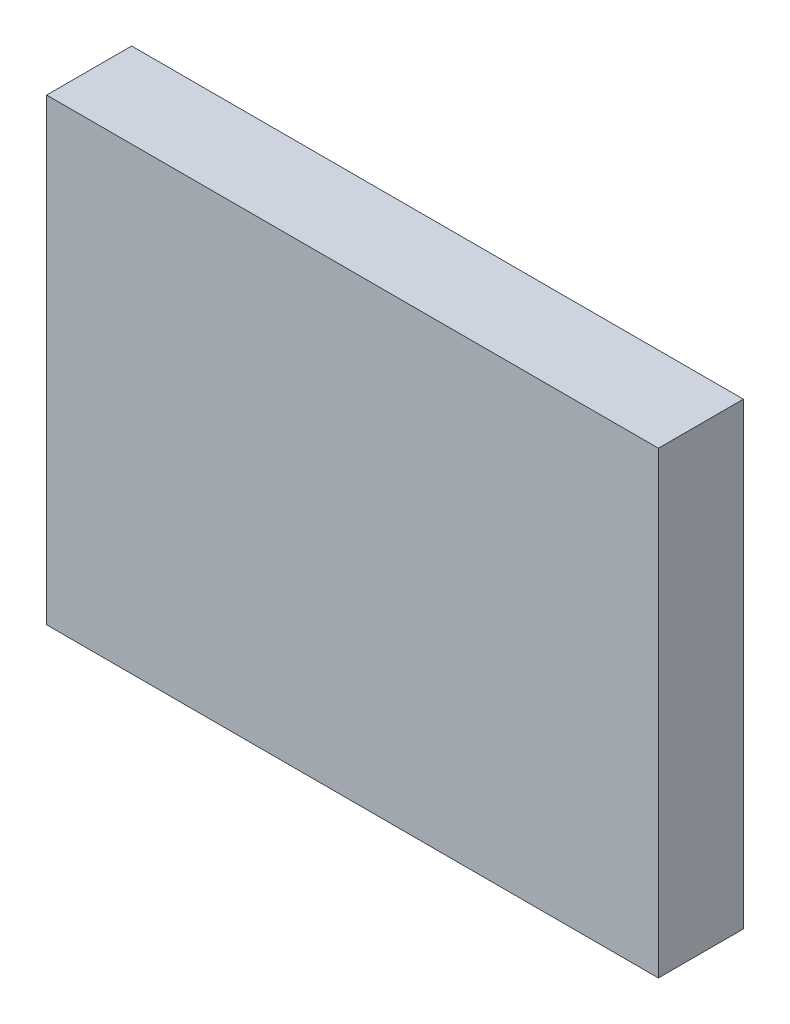
ISO-10303-21;
HEADER;
FILE_DESCRIPTION(('STEP AP214'),'2;1');
FILE_NAME('part.step','',(''),(''),'','','');
FILE_SCHEMA(('AUTOMOTIVE_DESIGN { 1 0 10303 214 1 1 1 1 }'));
ENDSEC;
DATA;
#1=APPLICATION_CONTEXT('core data for automotive mechanical design processes');
#2=APPLICATION_PROTOCOL_DEFINITION('international standard','automotive_design',2000,#1);
#3=PRODUCT_CONTEXT('',#1,'mechanical');
#4=PRODUCT('Part','Part','',(#3));
#5=PRODUCT_RELATED_PRODUCT_CATEGORY('part','',(#4));
#6=PRODUCT_DEFINITION_FORMATION('','',#4);
#7=PRODUCT_DEFINITION_CONTEXT('part definition',#1,'design');
#8=PRODUCT_DEFINITION('design','',#6,#7);
#9=PRODUCT_DEFINITION_SHAPE('','',#8);
#10=(LENGTH_UNIT() NAMED_UNIT(*) SI_UNIT(.MILLI.,.METRE.));
#11=(NAMED_UNIT(*) PLANE_ANGLE_UNIT() SI_UNIT($,.RADIAN.));
#12=(NAMED_UNIT(*) SI_UNIT($,.STERADIAN.) SOLID_ANGLE_UNIT());
#13=UNCERTAINTY_MEASURE_WITH_UNIT(LENGTH_MEASURE(1.E-05),#10,'distance_accuracy_value','');
#14=(GEOMETRIC_REPRESENTATION_CONTEXT(3) GLOBAL_UNCERTAINTY_ASSIGNED_CONTEXT((#13)) GLOBAL_UNIT_ASSIGNED_CONTEXT((#10,
#11,#12)) REPRESENTATION_CONTEXT('',''));
#15=CARTESIAN_POINT('',(0.,0.,0.));
#16=DIRECTION('',(0.,0.,1.));
#17=DIRECTION('',(1.,0.,0.));
#18=AXIS2_PLACEMENT_3D('',#15,#16,#17);
#19=CARTESIAN_POINT('',(180.,135.,50.));
#20=DIRECTION('',(-1.,0.,0.));
#21=DIRECTION('',(0.,0.,1.));
#22=AXIS2_PLACEMENT_3D('',#19,#20,#21);
#23=PLANE('',#22);
#24=DIRECTION('',(0.,1.,0.));
#25=VECTOR('',#24,1.);
#26=CARTESIAN_POINT('',(180.,135.,0.));
#27=LINE('',#26,#25);
#28=CARTESIAN_POINT('',(180.,-135.,0.));
#29=VERTEX_POINT('',#28);
#30=CARTESIAN_POINT('',(180.,135.,0.));
#31=VERTEX_POINT('',#30);
#32=EDGE_CURVE('E106',#29,#31,#27,.T.);
#33=ORIENTED_EDGE('',*,*,#32,.T.);
#34=DIRECTION('',(0.,0.,-1.));
#35=VECTOR('',#34,1.);
#36=CARTESIAN_POINT('',(180.,135.,50.));
#37=LINE('',#36,#35);
#38=CARTESIAN_POINT('',(180.,135.,50.));
#39=VERTEX_POINT('',#38);
#40=EDGE_CURVE('E11',#39,#31,#37,.T.);
#41=ORIENTED_EDGE('',*,*,#40,.F.);
#42=DIRECTION('',(0.,1.,0.));
#43=VECTOR('',#42,1.);
#44=CARTESIAN_POINT('',(180.,135.,50.));
#45=LINE('',#44,#43);
#46=CARTESIAN_POINT('',(180.,-135.,50.));
#47=VERTEX_POINT('',#46);
#48=EDGE_CURVE('E89',#47,#39,#45,.T.);
#49=ORIENTED_EDGE('',*,*,#48,.F.);
#50=DIRECTION('',(0.,0.,-1.));
#51=VECTOR('',#50,1.);
#52=CARTESIAN_POINT('',(180.,-135.,50.));
#53=LINE('',#52,#51);
#54=EDGE_CURVE('E102',#47,#29,#53,.T.);
#55=ORIENTED_EDGE('',*,*,#54,.T.);
#56=EDGE_LOOP('',(#33,#41,#49,#55));
#57=FACE_BOUND('',#56,.T.);
#58=ADVANCED_FACE('F38',(#57),#23,.F.);
#59=CARTESIAN_POINT('',(-180.,135.,50.));
#60=DIRECTION('',(0.,-1.,0.));
#61=DIRECTION('',(0.,0.,-1.));
#62=AXIS2_PLACEMENT_3D('',#59,#60,#61);
#63=PLANE('',#62);
#64=DIRECTION('',(-1.,0.,0.));
#65=VECTOR('',#64,1.);
#66=CARTESIAN_POINT('',(-180.,135.,0.));
#67=LINE('',#66,#65);
#68=CARTESIAN_POINT('',(-180.,135.,0.));
#69=VERTEX_POINT('',#68);
#70=EDGE_CURVE('E94',#31,#69,#67,.T.);
#71=ORIENTED_EDGE('',*,*,#70,.T.);
#72=DIRECTION('',(0.,0.,-1.));
#73=VECTOR('',#72,1.);
#74=CARTESIAN_POINT('',(-180.,135.,50.));
#75=LINE('',#74,#73);
#76=CARTESIAN_POINT('',(-180.,135.,50.));
#77=VERTEX_POINT('',#76);
#78=EDGE_CURVE('E46',#77,#69,#75,.T.);
#79=ORIENTED_EDGE('',*,*,#78,.F.);
#80=DIRECTION('',(-1.,0.,0.));
#81=VECTOR('',#80,1.);
#82=CARTESIAN_POINT('',(-180.,135.,50.));
#83=LINE('',#82,#81);
#84=EDGE_CURVE('E84',#39,#77,#83,.T.);
#85=ORIENTED_EDGE('',*,*,#84,.F.);
#86=ORIENTED_EDGE('',*,*,#40,.T.);
#87=EDGE_LOOP('',(#71,#79,#85,#86));
#88=FACE_BOUND('',#87,.T.);
#89=ADVANCED_FACE('F93',(#88),#63,.F.);
#90=CARTESIAN_POINT('',(-180.,135.,50.));
#91=DIRECTION('',(1.,0.,0.));
#92=DIRECTION('',(0.,0.,-1.));
#93=AXIS2_PLACEMENT_3D('',#90,#91,#92);
#94=PLANE('',#93);
#95=DIRECTION('',(0.,-1.,0.));
#96=VECTOR('',#95,1.);
#97=CARTESIAN_POINT('',(-180.,135.,0.));
#98=LINE('',#97,#96);
#99=CARTESIAN_POINT('',(-180.,-135.,0.));
#100=VERTEX_POINT('',#99);
#101=EDGE_CURVE('E71',#69,#100,#98,.T.);
#102=ORIENTED_EDGE('',*,*,#101,.T.);
#103=DIRECTION('',(0.,0.,-1.));
#104=VECTOR('',#103,1.);
#105=CARTESIAN_POINT('',(-180.,-135.,50.));
#106=LINE('',#105,#104);
#107=CARTESIAN_POINT('',(-180.,-135.,50.));
#108=VERTEX_POINT('',#107);
#109=EDGE_CURVE('E95',#108,#100,#106,.T.);
#110=ORIENTED_EDGE('',*,*,#109,.F.);
#111=DIRECTION('',(0.,-1.,0.));
#112=VECTOR('',#111,1.);
#113=CARTESIAN_POINT('',(-180.,135.,50.));
#114=LINE('',#113,#112);
#115=EDGE_CURVE('E87',#77,#108,#114,.T.);
#116=ORIENTED_EDGE('',*,*,#115,.F.);
#117=ORIENTED_EDGE('',*,*,#78,.T.);
#118=EDGE_LOOP('',(#102,#110,#116,#117));
#119=FACE_BOUND('',#118,.T.);
#120=ADVANCED_FACE('F96',(#119),#94,.F.);
#121=CARTESIAN_POINT('',(-180.,-135.,50.));
#122=DIRECTION('',(0.,1.,0.));
#123=DIRECTION('',(0.,0.,1.));
#124=AXIS2_PLACEMENT_3D('',#121,#122,#123);
#125=PLANE('',#124);
#126=DIRECTION('',(1.,0.,0.));
#127=VECTOR('',#126,1.);
#128=CARTESIAN_POINT('',(-180.,-135.,0.));
#129=LINE('',#128,#127);
#130=EDGE_CURVE('E77',#100,#29,#129,.T.);
#131=ORIENTED_EDGE('',*,*,#130,.T.);
#132=ORIENTED_EDGE('',*,*,#54,.F.);
#133=DIRECTION('',(1.,0.,0.));
#134=VECTOR('',#133,1.);
#135=CARTESIAN_POINT('',(-180.,-135.,50.));
#136=LINE('',#135,#134);
#137=EDGE_CURVE('E54',#108,#47,#136,.T.);
#138=ORIENTED_EDGE('',*,*,#137,.F.);
#139=ORIENTED_EDGE('',*,*,#109,.T.);
#140=EDGE_LOOP('',(#131,#132,#138,#139));
#141=FACE_BOUND('',#140,.T.);
#142=ADVANCED_FACE('F114',(#141),#125,.F.);
#143=CARTESIAN_POINT('',(0.,0.,50.));
#144=DIRECTION('',(0.,0.,1.));
#145=DIRECTION('',(1.,0.,0.));
#146=AXIS2_PLACEMENT_3D('',#143,#144,#145);
#147=PLANE('',#146);
#148=ORIENTED_EDGE('',*,*,#48,.T.);
#149=ORIENTED_EDGE('',*,*,#84,.T.);
#150=ORIENTED_EDGE('',*,*,#115,.T.);
#151=ORIENTED_EDGE('',*,*,#137,.T.);
#152=EDGE_LOOP('',(#148,#149,#150,#151));
#153=FACE_BOUND('',#152,.T.);
#154=ADVANCED_FACE('F85',(#153),#147,.T.);
#155=CARTESIAN_POINT('',(0.,0.,0.));
#156=DIRECTION('',(0.,0.,1.));
#157=DIRECTION('',(1.,0.,0.));
#158=AXIS2_PLACEMENT_3D('',#155,#156,#157);
#159=PLANE('',#158);
#160=ORIENTED_EDGE('',*,*,#32,.F.);
#161=ORIENTED_EDGE('',*,*,#130,.F.);
#162=ORIENTED_EDGE('',*,*,#101,.F.);
#163=ORIENTED_EDGE('',*,*,#70,.F.);
#164=EDGE_LOOP('',(#160,#161,#162,#163));
#165=FACE_BOUND('',#164,.T.);
#166=ADVANCED_FACE('F117',(#165),#159,.F.);
#167=CLOSED_SHELL('',(#58,#89,#120,#142,#154,#166));
#168=MANIFOLD_SOLID_BREP('B2',#167);
#169=ADVANCED_BREP_SHAPE_REPRESENTATION('',(#18,#168),#14);
#170=SHAPE_DEFINITION_REPRESENTATION(#9,#169);
ENDSEC;
END-ISO-10303-21;
